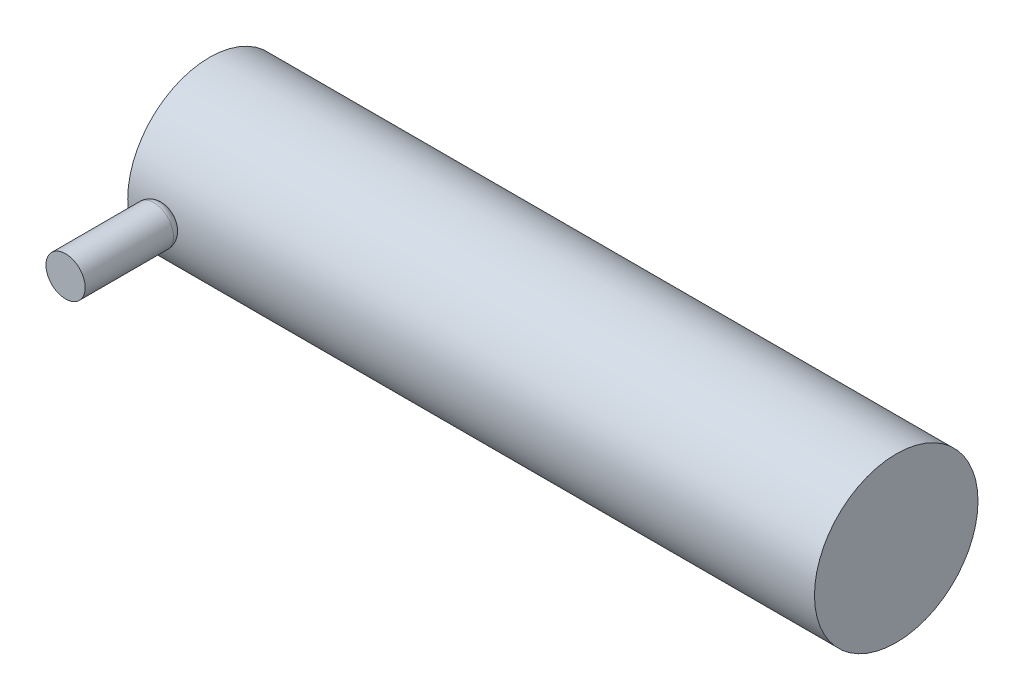
ISO-10303-21;
HEADER;
FILE_DESCRIPTION(('STEP AP214'),'2;1');
FILE_NAME('part.step','',(''),(''),'','','');
FILE_SCHEMA(('AUTOMOTIVE_DESIGN { 1 0 10303 214 1 1 1 1 }'));
ENDSEC;
DATA;
#1=APPLICATION_CONTEXT('core data for automotive mechanical design processes');
#2=APPLICATION_PROTOCOL_DEFINITION('international standard','automotive_design',2000,#1);
#3=PRODUCT_CONTEXT('',#1,'mechanical');
#4=PRODUCT('Part','Part','',(#3));
#5=PRODUCT_RELATED_PRODUCT_CATEGORY('part','',(#4));
#6=PRODUCT_DEFINITION_FORMATION('','',#4);
#7=PRODUCT_DEFINITION_CONTEXT('part definition',#1,'design');
#8=PRODUCT_DEFINITION('design','',#6,#7);
#9=PRODUCT_DEFINITION_SHAPE('','',#8);
#10=(LENGTH_UNIT() NAMED_UNIT(*) SI_UNIT(.MILLI.,.METRE.));
#11=(NAMED_UNIT(*) PLANE_ANGLE_UNIT() SI_UNIT($,.RADIAN.));
#12=(NAMED_UNIT(*) SI_UNIT($,.STERADIAN.) SOLID_ANGLE_UNIT());
#13=UNCERTAINTY_MEASURE_WITH_UNIT(LENGTH_MEASURE(1.E-05),#10,'distance_accuracy_value','');
#14=(GEOMETRIC_REPRESENTATION_CONTEXT(3) GLOBAL_UNCERTAINTY_ASSIGNED_CONTEXT((#13)) GLOBAL_UNIT_ASSIGNED_CONTEXT((#10,
#11,#12)) REPRESENTATION_CONTEXT('',''));
#15=CARTESIAN_POINT('',(0.,0.,0.));
#16=DIRECTION('',(0.,0.,1.));
#17=DIRECTION('',(1.,0.,0.));
#18=AXIS2_PLACEMENT_3D('',#15,#16,#17);
#19=CARTESIAN_POINT('',(-199.,0.,55.));
#20=DIRECTION('',(0.,0.,-1.));
#21=DIRECTION('',(-1.,0.,0.));
#22=AXIS2_PLACEMENT_3D('',#19,#20,#21);
#23=CYLINDRICAL_SURFACE('',#22,6.00000000000002);
#24=CARTESIAN_POINT('',(-199.,0.,28.));
#25=DIRECTION('',(0.,0.,1.));
#26=DIRECTION('',(1.,0.,0.));
#27=AXIS2_PLACEMENT_3D('',#24,#25,#26);
#28=CIRCLE('',#27,6.00000000000002);
#29=CARTESIAN_POINT('',(-193.,0.,28.));
#30=VERTEX_POINT('',#29);
#31=EDGE_CURVE('E48',#30,#30,#28,.T.);
#32=ORIENTED_EDGE('',*,*,#31,.T.);
#33=EDGE_LOOP('',(#32));
#34=FACE_BOUND('',#33,.T.);
#35=CARTESIAN_POINT('',(-199.,0.,55.));
#36=DIRECTION('',(0.,0.,1.));
#37=DIRECTION('',(1.,0.,0.));
#38=AXIS2_PLACEMENT_3D('',#35,#36,#37);
#39=CIRCLE('',#38,6.00000000000002);
#40=CARTESIAN_POINT('',(-193.,0.,55.));
#41=VERTEX_POINT('',#40);
#42=EDGE_CURVE('E52',#41,#41,#39,.T.);
#43=ORIENTED_EDGE('',*,*,#42,.F.);
#44=EDGE_LOOP('',(#43));
#45=FACE_BOUND('',#44,.T.);
#46=ADVANCED_FACE('F41',(#34,#45),#23,.T.);
#47=CARTESIAN_POINT('',(-199.,0.,55.));
#48=DIRECTION('',(0.,0.,1.));
#49=DIRECTION('',(1.,0.,0.));
#50=AXIS2_PLACEMENT_3D('',#47,#48,#49);
#51=PLANE('',#50);
#52=ORIENTED_EDGE('',*,*,#42,.T.);
#53=EDGE_LOOP('',(#52));
#54=FACE_BOUND('',#53,.T.);
#55=ADVANCED_FACE('F59',(#54),#51,.T.);
#56=CARTESIAN_POINT('',(-199.,0.,25.));
#57=DIRECTION('',(0.,0.,1.));
#58=DIRECTION('',(1.,0.,0.));
#59=AXIS2_PLACEMENT_3D('',#56,#57,#58);
#60=PLANE('',#59);
#61=CARTESIAN_POINT('',(-199.,0.,25.));
#62=DIRECTION('',(0.,0.,1.));
#63=DIRECTION('',(1.,0.,0.));
#64=AXIS2_PLACEMENT_3D('',#61,#62,#63);
#65=CIRCLE('',#64,3.00000000000002);
#66=CARTESIAN_POINT('',(-196.,0.,25.));
#67=VERTEX_POINT('',#66);
#68=EDGE_CURVE('E11',#67,#67,#65,.F.);
#69=ORIENTED_EDGE('',*,*,#68,.T.);
#70=EDGE_LOOP('',(#69));
#71=FACE_BOUND('',#70,.T.);
#72=ADVANCED_FACE('F65',(#71),#60,.F.);
#73=CARTESIAN_POINT('',(-199.,0.,28.));
#74=DIRECTION('',(0.,0.,1.));
#75=DIRECTION('',(1.,0.,0.));
#76=AXIS2_PLACEMENT_3D('',#73,#74,#75);
#77=TOROIDAL_SURFACE('',#76,3.00000000000002,3.);
#78=ORIENTED_EDGE('',*,*,#68,.F.);
#79=EDGE_LOOP('',(#78));
#80=FACE_BOUND('',#79,.T.);
#81=ORIENTED_EDGE('',*,*,#31,.F.);
#82=EDGE_LOOP('',(#81));
#83=FACE_BOUND('',#82,.T.);
#84=ADVANCED_FACE('F43',(#80,#83),#77,.T.);
#85=CLOSED_SHELL('',(#46,#55,#72,#84));
#86=MANIFOLD_SOLID_BREP('B2',#85);
#87=CARTESIAN_POINT('',(-210.,0.,0.));
#88=DIRECTION('',(1.,0.,0.));
#89=DIRECTION('',(0.,0.,-1.));
#90=AXIS2_PLACEMENT_3D('',#87,#88,#89);
#91=CYLINDRICAL_SURFACE('',#90,25.);
#92=CARTESIAN_POINT('',(-210.,0.,0.));
#93=DIRECTION('',(1.,0.,0.));
#94=DIRECTION('',(0.,0.,-1.));
#95=AXIS2_PLACEMENT_3D('',#92,#93,#94);
#96=CIRCLE('',#95,25.);
#97=CARTESIAN_POINT('',(-210.,0.,-25.));
#98=VERTEX_POINT('',#97);
#99=EDGE_CURVE('E40',#98,#98,#96,.T.);
#100=ORIENTED_EDGE('',*,*,#99,.T.);
#101=EDGE_LOOP('',(#100));
#102=FACE_BOUND('',#101,.T.);
#103=CARTESIAN_POINT('',(0.,0.,0.));
#104=DIRECTION('',(1.,0.,0.));
#105=DIRECTION('',(0.,0.,-1.));
#106=AXIS2_PLACEMENT_3D('',#103,#104,#105);
#107=CIRCLE('',#106,25.);
#108=CARTESIAN_POINT('',(0.,0.,-25.));
#109=VERTEX_POINT('',#108);
#110=EDGE_CURVE('E100',#109,#109,#107,.T.);
#111=ORIENTED_EDGE('',*,*,#110,.F.);
#112=EDGE_LOOP('',(#111));
#113=FACE_BOUND('',#112,.T.);
#114=ADVANCED_FACE('F97',(#102,#113),#91,.T.);
#115=CARTESIAN_POINT('',(-210.,0.,0.));
#116=DIRECTION('',(1.,0.,0.));
#117=DIRECTION('',(0.,0.,-1.));
#118=AXIS2_PLACEMENT_3D('',#115,#116,#117);
#119=PLANE('',#118);
#120=ORIENTED_EDGE('',*,*,#99,.F.);
#121=EDGE_LOOP('',(#120));
#122=FACE_BOUND('',#121,.T.);
#123=ADVANCED_FACE('F112',(#122),#119,.F.);
#124=CARTESIAN_POINT('',(0.,0.,0.));
#125=DIRECTION('',(1.,0.,0.));
#126=DIRECTION('',(0.,0.,-1.));
#127=AXIS2_PLACEMENT_3D('',#124,#125,#126);
#128=PLANE('',#127);
#129=ORIENTED_EDGE('',*,*,#110,.T.);
#130=EDGE_LOOP('',(#129));
#131=FACE_BOUND('',#130,.T.);
#132=ADVANCED_FACE('F109',(#131),#128,.T.);
#133=CLOSED_SHELL('',(#114,#123,#132));
#134=MANIFOLD_SOLID_BREP('B6',#133);
#135=ADVANCED_BREP_SHAPE_REPRESENTATION('',(#18,#86,#134),#14);
#136=SHAPE_DEFINITION_REPRESENTATION(#9,#135);
ENDSEC;
END-ISO-10303-21;
